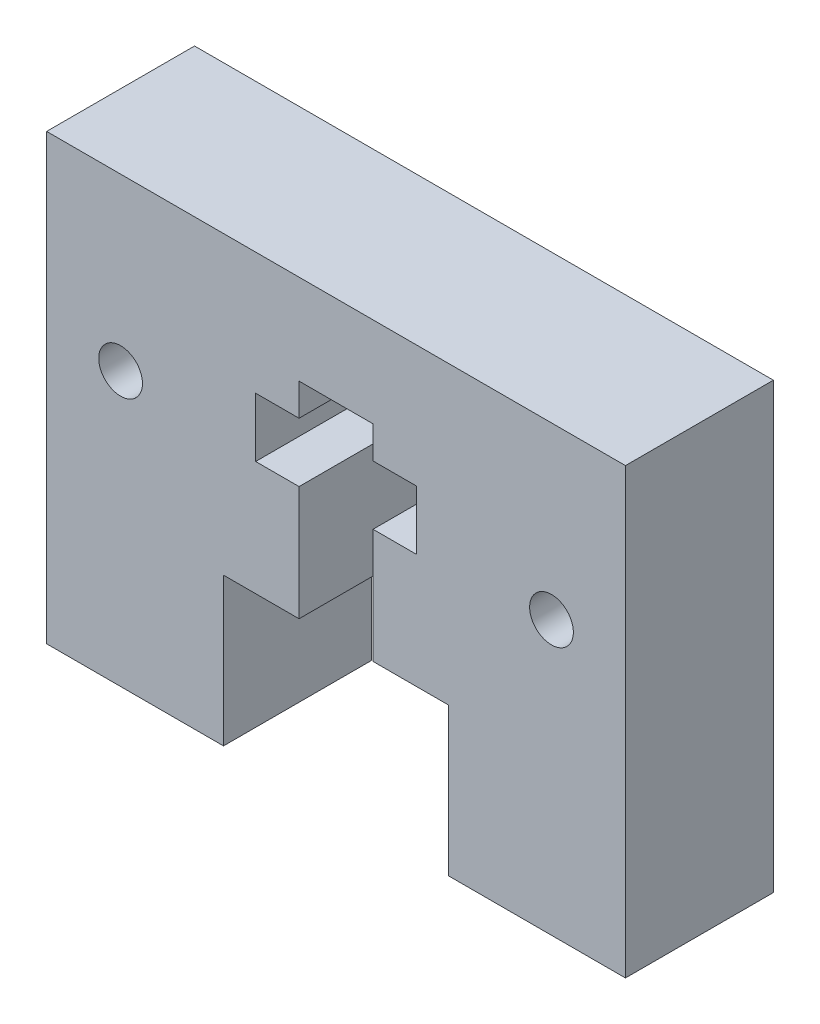
ISO-10303-21;
HEADER;
FILE_DESCRIPTION(('STEP AP214'),'2;1');
FILE_NAME('part.step','',(''),(''),'','','');
FILE_SCHEMA(('AUTOMOTIVE_DESIGN { 1 0 10303 214 1 1 1 1 }'));
ENDSEC;
DATA;
#1=APPLICATION_CONTEXT('core data for automotive mechanical design processes');
#2=APPLICATION_PROTOCOL_DEFINITION('international standard','automotive_design',2000,#1);
#3=PRODUCT_CONTEXT('',#1,'mechanical');
#4=PRODUCT('Part','Part','',(#3));
#5=PRODUCT_RELATED_PRODUCT_CATEGORY('part','',(#4));
#6=PRODUCT_DEFINITION_FORMATION('','',#4);
#7=PRODUCT_DEFINITION_CONTEXT('part definition',#1,'design');
#8=PRODUCT_DEFINITION('design','',#6,#7);
#9=PRODUCT_DEFINITION_SHAPE('','',#8);
#10=(LENGTH_UNIT() NAMED_UNIT(*) SI_UNIT(.MILLI.,.METRE.));
#11=(NAMED_UNIT(*) PLANE_ANGLE_UNIT() SI_UNIT($,.RADIAN.));
#12=(NAMED_UNIT(*) SI_UNIT($,.STERADIAN.) SOLID_ANGLE_UNIT());
#13=UNCERTAINTY_MEASURE_WITH_UNIT(LENGTH_MEASURE(1.E-05),#10,'distance_accuracy_value','');
#14=(GEOMETRIC_REPRESENTATION_CONTEXT(3) GLOBAL_UNCERTAINTY_ASSIGNED_CONTEXT((#13)) GLOBAL_UNIT_ASSIGNED_CONTEXT((#10,
#11,#12)) REPRESENTATION_CONTEXT('',''));
#15=CARTESIAN_POINT('',(0.,0.,0.));
#16=DIRECTION('',(0.,0.,1.));
#17=DIRECTION('',(1.,0.,0.));
#18=AXIS2_PLACEMENT_3D('',#15,#16,#17);
#19=CARTESIAN_POINT('',(-35.71875,0.,5.842));
#20=DIRECTION('',(0.,1.,0.));
#21=DIRECTION('',(0.,0.,1.));
#22=AXIS2_PLACEMENT_3D('',#19,#20,#21);
#23=PLANE('',#22);
#24=DIRECTION('',(1.,0.,0.));
#25=VECTOR('',#24,1.);
#26=CARTESIAN_POINT('',(-35.71875,0.,0.));
#27=LINE('',#26,#25);
#28=CARTESIAN_POINT('',(-35.71875,0.,0.));
#29=VERTEX_POINT('',#28);
#30=CARTESIAN_POINT('',(-32.73425,0.,0.));
#31=VERTEX_POINT('',#30);
#32=EDGE_CURVE('E148',#29,#31,#27,.T.);
#33=ORIENTED_EDGE('',*,*,#32,.T.);
#34=DIRECTION('',(0.,0.,1.));
#35=VECTOR('',#34,1.);
#36=CARTESIAN_POINT('',(-32.73425,0.,0.));
#37=LINE('',#36,#35);
#38=CARTESIAN_POINT('',(-32.73425,0.,5.842));
#39=VERTEX_POINT('',#38);
#40=EDGE_CURVE('E182',#31,#39,#37,.T.);
#41=ORIENTED_EDGE('',*,*,#40,.T.);
#42=DIRECTION('',(1.,0.,0.));
#43=VECTOR('',#42,1.);
#44=CARTESIAN_POINT('',(-35.71875,0.,5.842));
#45=LINE('',#44,#43);
#46=CARTESIAN_POINT('',(-35.71875,0.,5.842));
#47=VERTEX_POINT('',#46);
#48=EDGE_CURVE('E118',#47,#39,#45,.T.);
#49=ORIENTED_EDGE('',*,*,#48,.F.);
#50=DIRECTION('',(0.,0.,-1.));
#51=VECTOR('',#50,1.);
#52=CARTESIAN_POINT('',(-35.71875,0.,5.842));
#53=LINE('',#52,#51);
#54=EDGE_CURVE('E128',#47,#29,#53,.T.);
#55=ORIENTED_EDGE('',*,*,#54,.T.);
#56=EDGE_LOOP('',(#33,#41,#49,#55));
#57=FACE_BOUND('',#56,.T.);
#58=ADVANCED_FACE('F34',(#57),#23,.F.);
#59=CARTESIAN_POINT('',(0.,0.,5.842));
#60=DIRECTION('',(0.,0.,1.));
#61=DIRECTION('',(1.,0.,0.));
#62=AXIS2_PLACEMENT_3D('',#59,#60,#61);
#63=PLANE('',#62);
#64=DIRECTION('',(0.,-1.,0.));
#65=VECTOR('',#64,1.);
#66=CARTESIAN_POINT('',(-32.73425,0.,5.842));
#67=LINE('',#66,#65);
#68=CARTESIAN_POINT('',(-32.73425,4.5212,5.842));
#69=VERTEX_POINT('',#68);
#70=EDGE_CURVE('E350',#69,#39,#67,.T.);
#71=ORIENTED_EDGE('',*,*,#70,.F.);
#72=DIRECTION('',(1.,0.,0.));
#73=VECTOR('',#72,1.);
#74=CARTESIAN_POINT('',(-32.73425,4.5212,5.842));
#75=LINE('',#74,#73);
#76=CARTESIAN_POINT('',(-34.44875,4.5212,5.842));
#77=VERTEX_POINT('',#76);
#78=EDGE_CURVE('E354',#77,#69,#75,.T.);
#79=ORIENTED_EDGE('',*,*,#78,.F.);
#80=DIRECTION('',(0.,-1.,0.));
#81=VECTOR('',#80,1.);
#82=CARTESIAN_POINT('',(-34.44875,4.5212,5.842));
#83=LINE('',#82,#81);
#84=CARTESIAN_POINT('',(-34.44875,6.858,5.842));
#85=VERTEX_POINT('',#84);
#86=EDGE_CURVE('E358',#85,#77,#83,.T.);
#87=ORIENTED_EDGE('',*,*,#86,.F.);
#88=DIRECTION('',(-1.,0.,0.));
#89=VECTOR('',#88,1.);
#90=CARTESIAN_POINT('',(-34.44875,6.858,5.842));
#91=LINE('',#90,#89);
#92=CARTESIAN_POINT('',(-32.73425,6.858,5.842));
#93=VERTEX_POINT('',#92);
#94=EDGE_CURVE('E406',#93,#85,#91,.T.);
#95=ORIENTED_EDGE('',*,*,#94,.F.);
#96=DIRECTION('',(0.,-1.,0.));
#97=VECTOR('',#96,1.);
#98=CARTESIAN_POINT('',(-32.73425,6.858,5.842));
#99=LINE('',#98,#97);
#100=CARTESIAN_POINT('',(-32.73425,8.128,5.842));
#101=VERTEX_POINT('',#100);
#102=EDGE_CURVE('E403',#101,#93,#99,.T.);
#103=ORIENTED_EDGE('',*,*,#102,.F.);
#104=DIRECTION('',(-1.,0.,0.));
#105=VECTOR('',#104,1.);
#106=CARTESIAN_POINT('',(-32.73425,8.128,5.842));
#107=LINE('',#106,#105);
#108=CARTESIAN_POINT('',(-29.81325,8.128,5.842));
#109=VERTEX_POINT('',#108);
#110=EDGE_CURVE('E400',#109,#101,#107,.T.);
#111=ORIENTED_EDGE('',*,*,#110,.F.);
#112=DIRECTION('',(0.,1.,0.));
#113=VECTOR('',#112,1.);
#114=CARTESIAN_POINT('',(-29.81325,8.128,5.842));
#115=LINE('',#114,#113);
#116=CARTESIAN_POINT('',(-29.81325,6.858,5.842));
#117=VERTEX_POINT('',#116);
#118=EDGE_CURVE('E397',#117,#109,#115,.T.);
#119=ORIENTED_EDGE('',*,*,#118,.F.);
#120=DIRECTION('',(-1.,0.,0.));
#121=VECTOR('',#120,1.);
#122=CARTESIAN_POINT('',(-29.81325,6.858,5.842));
#123=LINE('',#122,#121);
#124=CARTESIAN_POINT('',(-28.09875,6.858,5.842));
#125=VERTEX_POINT('',#124);
#126=EDGE_CURVE('E394',#125,#117,#123,.T.);
#127=ORIENTED_EDGE('',*,*,#126,.F.);
#128=DIRECTION('',(0.,1.,0.));
#129=VECTOR('',#128,1.);
#130=CARTESIAN_POINT('',(-28.09875,6.858,5.842));
#131=LINE('',#130,#129);
#132=CARTESIAN_POINT('',(-28.09875,4.5212,5.842));
#133=VERTEX_POINT('',#132);
#134=EDGE_CURVE('E391',#133,#125,#131,.T.);
#135=ORIENTED_EDGE('',*,*,#134,.F.);
#136=DIRECTION('',(1.,0.,0.));
#137=VECTOR('',#136,1.);
#138=CARTESIAN_POINT('',(-28.09875,4.5212,5.842));
#139=LINE('',#138,#137);
#140=CARTESIAN_POINT('',(-29.81325,4.5212,5.842));
#141=VERTEX_POINT('',#140);
#142=EDGE_CURVE('E389',#141,#133,#139,.T.);
#143=ORIENTED_EDGE('',*,*,#142,.F.);
#144=DIRECTION('',(0.,1.,0.));
#145=VECTOR('',#144,1.);
#146=CARTESIAN_POINT('',(-29.81325,4.5212,5.842));
#147=LINE('',#146,#145);
#148=CARTESIAN_POINT('',(-29.81325,0.,5.842));
#149=VERTEX_POINT('',#148);
#150=EDGE_CURVE('E116',#149,#141,#147,.T.);
#151=ORIENTED_EDGE('',*,*,#150,.F.);
#152=CARTESIAN_POINT('',(-26.82875,0.,5.842));
#153=VERTEX_POINT('',#152);
#154=EDGE_CURVE('E105',#149,#153,#45,.T.);
#155=ORIENTED_EDGE('',*,*,#154,.T.);
#156=DIRECTION('',(0.,-1.,0.));
#157=VECTOR('',#156,1.);
#158=CARTESIAN_POINT('',(-26.82875,0.,5.842));
#159=LINE('',#158,#157);
#160=CARTESIAN_POINT('',(-26.82875,-5.842,5.842));
#161=VERTEX_POINT('',#160);
#162=EDGE_CURVE('E111',#153,#161,#159,.T.);
#163=ORIENTED_EDGE('',*,*,#162,.T.);
#164=DIRECTION('',(1.,0.,0.));
#165=VECTOR('',#164,1.);
#166=CARTESIAN_POINT('',(-26.82875,-5.842,5.842));
#167=LINE('',#166,#165);
#168=CARTESIAN_POINT('',(-19.84375,-5.842,5.842));
#169=VERTEX_POINT('',#168);
#170=EDGE_CURVE('E58',#161,#169,#167,.T.);
#171=ORIENTED_EDGE('',*,*,#170,.T.);
#172=DIRECTION('',(0.,1.,0.));
#173=VECTOR('',#172,1.);
#174=CARTESIAN_POINT('',(-19.84375,-5.842,5.842));
#175=LINE('',#174,#173);
#176=CARTESIAN_POINT('',(-19.84375,11.684,5.842));
#177=VERTEX_POINT('',#176);
#178=EDGE_CURVE('E133',#169,#177,#175,.T.);
#179=ORIENTED_EDGE('',*,*,#178,.T.);
#180=DIRECTION('',(-1.,0.,0.));
#181=VECTOR('',#180,1.);
#182=CARTESIAN_POINT('',(-42.70375,11.684,5.842));
#183=LINE('',#182,#181);
#184=CARTESIAN_POINT('',(-42.70375,11.684,5.842));
#185=VERTEX_POINT('',#184);
#186=EDGE_CURVE('E247',#177,#185,#183,.T.);
#187=ORIENTED_EDGE('',*,*,#186,.T.);
#188=DIRECTION('',(0.,-1.,0.));
#189=VECTOR('',#188,1.);
#190=CARTESIAN_POINT('',(-42.70375,7.874,5.842));
#191=LINE('',#190,#189);
#192=CARTESIAN_POINT('',(-42.70375,-5.842,5.842));
#193=VERTEX_POINT('',#192);
#194=EDGE_CURVE('E157',#185,#193,#191,.T.);
#195=ORIENTED_EDGE('',*,*,#194,.T.);
#196=DIRECTION('',(1.,0.,0.));
#197=VECTOR('',#196,1.);
#198=CARTESIAN_POINT('',(-42.70375,-5.842,5.842));
#199=LINE('',#198,#197);
#200=CARTESIAN_POINT('',(-35.71875,-5.842,5.842));
#201=VERTEX_POINT('',#200);
#202=EDGE_CURVE('E93',#193,#201,#199,.T.);
#203=ORIENTED_EDGE('',*,*,#202,.T.);
#204=DIRECTION('',(0.,1.,0.));
#205=VECTOR('',#204,1.);
#206=CARTESIAN_POINT('',(-35.71875,-5.842,5.842));
#207=LINE('',#206,#205);
#208=EDGE_CURVE('E119',#201,#47,#207,.T.);
#209=ORIENTED_EDGE('',*,*,#208,.T.);
#210=ORIENTED_EDGE('',*,*,#48,.T.);
#211=EDGE_LOOP('',(#71,#79,#87,#95,#103,#111,#119,#127,#135,#143,#151,#155,#163,#171,#179,#187,
#195,#203,#209,#210));
#212=FACE_BOUND('',#211,.T.);
#213=CARTESIAN_POINT('',(-39.78275,4.953,5.842));
#214=DIRECTION('',(0.,0.,1.));
#215=DIRECTION('',(1.,0.,0.));
#216=AXIS2_PLACEMENT_3D('',#213,#214,#215);
#217=CIRCLE('',#216,0.8636);
#218=CARTESIAN_POINT('',(-38.91915,4.953,5.842));
#219=VERTEX_POINT('',#218);
#220=EDGE_CURVE('E144',#219,#219,#217,.T.);
#221=ORIENTED_EDGE('',*,*,#220,.F.);
#222=EDGE_LOOP('',(#221));
#223=FACE_BOUND('',#222,.T.);
#224=CARTESIAN_POINT('',(-22.76475,4.95300000000001,5.842));
#225=DIRECTION('',(0.,0.,1.));
#226=DIRECTION('',(-1.,0.,0.));
#227=AXIS2_PLACEMENT_3D('',#224,#225,#226);
#228=CIRCLE('',#227,0.863599999999997);
#229=CARTESIAN_POINT('',(-23.62835,4.95300000000001,5.842));
#230=VERTEX_POINT('',#229);
#231=EDGE_CURVE('E255',#230,#230,#228,.T.);
#232=ORIENTED_EDGE('',*,*,#231,.F.);
#233=EDGE_LOOP('',(#232));
#234=FACE_BOUND('',#233,.T.);
#235=ADVANCED_FACE('F108',(#212,#223,#234),#63,.T.);
#236=CARTESIAN_POINT('',(0.,0.,0.));
#237=DIRECTION('',(0.,0.,1.));
#238=DIRECTION('',(1.,0.,0.));
#239=AXIS2_PLACEMENT_3D('',#236,#237,#238);
#240=PLANE('',#239);
#241=CARTESIAN_POINT('',(-39.78275,4.953,0.));
#242=DIRECTION('',(0.,0.,1.));
#243=DIRECTION('',(1.,0.,0.));
#244=AXIS2_PLACEMENT_3D('',#241,#242,#243);
#245=CIRCLE('',#244,0.8636);
#246=CARTESIAN_POINT('',(-38.91915,4.953,0.));
#247=VERTEX_POINT('',#246);
#248=EDGE_CURVE('E258',#247,#247,#245,.T.);
#249=ORIENTED_EDGE('',*,*,#248,.T.);
#250=EDGE_LOOP('',(#249));
#251=FACE_BOUND('',#250,.T.);
#252=DIRECTION('',(1.,0.,0.));
#253=VECTOR('',#252,1.);
#254=CARTESIAN_POINT('',(-32.73425,4.5212,0.));
#255=LINE('',#254,#253);
#256=CARTESIAN_POINT('',(-34.44875,4.5212,0.));
#257=VERTEX_POINT('',#256);
#258=CARTESIAN_POINT('',(-32.73425,4.5212,0.));
#259=VERTEX_POINT('',#258);
#260=EDGE_CURVE('E382',#257,#259,#255,.T.);
#261=ORIENTED_EDGE('',*,*,#260,.T.);
#262=DIRECTION('',(0.,-1.,0.));
#263=VECTOR('',#262,1.);
#264=CARTESIAN_POINT('',(-32.73425,0.,0.));
#265=LINE('',#264,#263);
#266=EDGE_CURVE('E176',#259,#31,#265,.T.);
#267=ORIENTED_EDGE('',*,*,#266,.T.);
#268=ORIENTED_EDGE('',*,*,#32,.F.);
#269=DIRECTION('',(0.,1.,0.));
#270=VECTOR('',#269,1.);
#271=CARTESIAN_POINT('',(-35.71875,-5.842,0.));
#272=LINE('',#271,#270);
#273=CARTESIAN_POINT('',(-35.71875,-5.842,0.));
#274=VERTEX_POINT('',#273);
#275=EDGE_CURVE('E146',#274,#29,#272,.T.);
#276=ORIENTED_EDGE('',*,*,#275,.F.);
#277=DIRECTION('',(1.,0.,0.));
#278=VECTOR('',#277,1.);
#279=CARTESIAN_POINT('',(-42.70375,-5.842,0.));
#280=LINE('',#279,#278);
#281=CARTESIAN_POINT('',(-42.70375,-5.842,0.));
#282=VERTEX_POINT('',#281);
#283=EDGE_CURVE('E143',#282,#274,#280,.T.);
#284=ORIENTED_EDGE('',*,*,#283,.F.);
#285=DIRECTION('',(0.,-1.,0.));
#286=VECTOR('',#285,1.);
#287=CARTESIAN_POINT('',(-42.70375,7.874,0.));
#288=LINE('',#287,#286);
#289=CARTESIAN_POINT('',(-42.70375,11.684,0.));
#290=VERTEX_POINT('',#289);
#291=EDGE_CURVE('E140',#290,#282,#288,.T.);
#292=ORIENTED_EDGE('',*,*,#291,.F.);
#293=DIRECTION('',(-1.,0.,0.));
#294=VECTOR('',#293,1.);
#295=CARTESIAN_POINT('',(-42.70375,11.684,0.));
#296=LINE('',#295,#294);
#297=CARTESIAN_POINT('',(-19.84375,11.684,0.));
#298=VERTEX_POINT('',#297);
#299=EDGE_CURVE('E232',#298,#290,#296,.T.);
#300=ORIENTED_EDGE('',*,*,#299,.F.);
#301=DIRECTION('',(0.,1.,0.));
#302=VECTOR('',#301,1.);
#303=CARTESIAN_POINT('',(-19.84375,-5.842,0.));
#304=LINE('',#303,#302);
#305=CARTESIAN_POINT('',(-19.84375,-5.842,0.));
#306=VERTEX_POINT('',#305);
#307=EDGE_CURVE('E154',#306,#298,#304,.T.);
#308=ORIENTED_EDGE('',*,*,#307,.F.);
#309=DIRECTION('',(1.,0.,0.));
#310=VECTOR('',#309,1.);
#311=CARTESIAN_POINT('',(-26.82875,-5.842,0.));
#312=LINE('',#311,#310);
#313=CARTESIAN_POINT('',(-26.82875,-5.842,0.));
#314=VERTEX_POINT('',#313);
#315=EDGE_CURVE('E85',#314,#306,#312,.T.);
#316=ORIENTED_EDGE('',*,*,#315,.F.);
#317=DIRECTION('',(0.,-1.,0.));
#318=VECTOR('',#317,1.);
#319=CARTESIAN_POINT('',(-26.82875,0.,0.));
#320=LINE('',#319,#318);
#321=CARTESIAN_POINT('',(-26.82875,0.,0.));
#322=VERTEX_POINT('',#321);
#323=EDGE_CURVE('E151',#322,#314,#320,.T.);
#324=ORIENTED_EDGE('',*,*,#323,.F.);
#325=CARTESIAN_POINT('',(-29.81325,0.,0.));
#326=VERTEX_POINT('',#325);
#327=EDGE_CURVE('E125',#326,#322,#27,.T.);
#328=ORIENTED_EDGE('',*,*,#327,.F.);
#329=DIRECTION('',(0.,1.,0.));
#330=VECTOR('',#329,1.);
#331=CARTESIAN_POINT('',(-29.81325,4.5212,0.));
#332=LINE('',#331,#330);
#333=CARTESIAN_POINT('',(-29.81325,4.5212,0.));
#334=VERTEX_POINT('',#333);
#335=EDGE_CURVE('E49',#326,#334,#332,.T.);
#336=ORIENTED_EDGE('',*,*,#335,.T.);
#337=DIRECTION('',(1.,0.,0.));
#338=VECTOR('',#337,1.);
#339=CARTESIAN_POINT('',(-28.09875,4.5212,0.));
#340=LINE('',#339,#338);
#341=CARTESIAN_POINT('',(-28.09875,4.5212,0.));
#342=VERTEX_POINT('',#341);
#343=EDGE_CURVE('E356',#334,#342,#340,.T.);
#344=ORIENTED_EDGE('',*,*,#343,.T.);
#345=DIRECTION('',(0.,1.,0.));
#346=VECTOR('',#345,1.);
#347=CARTESIAN_POINT('',(-28.09875,6.858,0.));
#348=LINE('',#347,#346);
#349=CARTESIAN_POINT('',(-28.09875,6.858,0.));
#350=VERTEX_POINT('',#349);
#351=EDGE_CURVE('E434',#342,#350,#348,.T.);
#352=ORIENTED_EDGE('',*,*,#351,.T.);
#353=DIRECTION('',(-1.,0.,0.));
#354=VECTOR('',#353,1.);
#355=CARTESIAN_POINT('',(-29.81325,6.858,0.));
#356=LINE('',#355,#354);
#357=CARTESIAN_POINT('',(-29.81325,6.858,0.));
#358=VERTEX_POINT('',#357);
#359=EDGE_CURVE('E431',#350,#358,#356,.T.);
#360=ORIENTED_EDGE('',*,*,#359,.T.);
#361=DIRECTION('',(0.,1.,0.));
#362=VECTOR('',#361,1.);
#363=CARTESIAN_POINT('',(-29.81325,8.128,0.));
#364=LINE('',#363,#362);
#365=CARTESIAN_POINT('',(-29.81325,8.128,0.));
#366=VERTEX_POINT('',#365);
#367=EDGE_CURVE('E428',#358,#366,#364,.T.);
#368=ORIENTED_EDGE('',*,*,#367,.T.);
#369=DIRECTION('',(-1.,0.,0.));
#370=VECTOR('',#369,1.);
#371=CARTESIAN_POINT('',(-32.73425,8.128,0.));
#372=LINE('',#371,#370);
#373=CARTESIAN_POINT('',(-32.73425,8.128,0.));
#374=VERTEX_POINT('',#373);
#375=EDGE_CURVE('E425',#366,#374,#372,.T.);
#376=ORIENTED_EDGE('',*,*,#375,.T.);
#377=DIRECTION('',(0.,-1.,0.));
#378=VECTOR('',#377,1.);
#379=CARTESIAN_POINT('',(-32.73425,6.858,0.));
#380=LINE('',#379,#378);
#381=CARTESIAN_POINT('',(-32.73425,6.858,0.));
#382=VERTEX_POINT('',#381);
#383=EDGE_CURVE('E421',#374,#382,#380,.T.);
#384=ORIENTED_EDGE('',*,*,#383,.T.);
#385=DIRECTION('',(-1.,0.,0.));
#386=VECTOR('',#385,1.);
#387=CARTESIAN_POINT('',(-34.44875,6.858,0.));
#388=LINE('',#387,#386);
#389=CARTESIAN_POINT('',(-34.44875,6.858,0.));
#390=VERTEX_POINT('',#389);
#391=EDGE_CURVE('E420',#382,#390,#388,.T.);
#392=ORIENTED_EDGE('',*,*,#391,.T.);
#393=DIRECTION('',(0.,-1.,0.));
#394=VECTOR('',#393,1.);
#395=CARTESIAN_POINT('',(-34.44875,4.5212,0.));
#396=LINE('',#395,#394);
#397=EDGE_CURVE('E384',#390,#257,#396,.T.);
#398=ORIENTED_EDGE('',*,*,#397,.T.);
#399=EDGE_LOOP('',(#261,#267,#268,#276,#284,#292,#300,#308,#316,#324,#328,#336,#344,#352,#360,
#368,#376,#384,#392,#398));
#400=FACE_BOUND('',#399,.T.);
#401=CARTESIAN_POINT('',(-22.76475,4.95300000000001,0.));
#402=DIRECTION('',(0.,0.,1.));
#403=DIRECTION('',(-1.,0.,0.));
#404=AXIS2_PLACEMENT_3D('',#401,#402,#403);
#405=CIRCLE('',#404,0.863599999999997);
#406=CARTESIAN_POINT('',(-23.62835,4.95300000000001,0.));
#407=VERTEX_POINT('',#406);
#408=EDGE_CURVE('E241',#407,#407,#405,.T.);
#409=ORIENTED_EDGE('',*,*,#408,.T.);
#410=EDGE_LOOP('',(#409));
#411=FACE_BOUND('',#410,.T.);
#412=ADVANCED_FACE('F170',(#251,#400,#411),#240,.F.);
#413=CARTESIAN_POINT('',(-42.70375,7.874,5.842));
#414=DIRECTION('',(1.,0.,0.));
#415=DIRECTION('',(0.,0.,-1.));
#416=AXIS2_PLACEMENT_3D('',#413,#414,#415);
#417=PLANE('',#416);
#418=ORIENTED_EDGE('',*,*,#291,.T.);
#419=DIRECTION('',(0.,0.,-1.));
#420=VECTOR('',#419,1.);
#421=CARTESIAN_POINT('',(-42.70375,-5.842,5.842));
#422=LINE('',#421,#420);
#423=EDGE_CURVE('E11',#193,#282,#422,.T.);
#424=ORIENTED_EDGE('',*,*,#423,.F.);
#425=ORIENTED_EDGE('',*,*,#194,.F.);
#426=DIRECTION('',(0.,0.,1.));
#427=VECTOR('',#426,1.);
#428=CARTESIAN_POINT('',(-42.70375,11.684,0.));
#429=LINE('',#428,#427);
#430=EDGE_CURVE('E237',#290,#185,#429,.T.);
#431=ORIENTED_EDGE('',*,*,#430,.F.);
#432=EDGE_LOOP('',(#418,#424,#425,#431));
#433=FACE_BOUND('',#432,.T.);
#434=ADVANCED_FACE('F36',(#433),#417,.F.);
#435=CARTESIAN_POINT('',(-42.70375,-5.842,5.842));
#436=DIRECTION('',(0.,1.,0.));
#437=DIRECTION('',(0.,0.,1.));
#438=AXIS2_PLACEMENT_3D('',#435,#436,#437);
#439=PLANE('',#438);
#440=ORIENTED_EDGE('',*,*,#283,.T.);
#441=DIRECTION('',(0.,0.,-1.));
#442=VECTOR('',#441,1.);
#443=CARTESIAN_POINT('',(-35.71875,-5.842,5.842));
#444=LINE('',#443,#442);
#445=EDGE_CURVE('E42',#201,#274,#444,.T.);
#446=ORIENTED_EDGE('',*,*,#445,.F.);
#447=ORIENTED_EDGE('',*,*,#202,.F.);
#448=ORIENTED_EDGE('',*,*,#423,.T.);
#449=EDGE_LOOP('',(#440,#446,#447,#448));
#450=FACE_BOUND('',#449,.T.);
#451=ADVANCED_FACE('F266',(#450),#439,.F.);
#452=CARTESIAN_POINT('',(-35.71875,-5.842,5.842));
#453=DIRECTION('',(-1.,0.,0.));
#454=DIRECTION('',(0.,-1.,0.));
#455=AXIS2_PLACEMENT_3D('',#452,#453,#454);
#456=PLANE('',#455);
#457=ORIENTED_EDGE('',*,*,#275,.T.);
#458=ORIENTED_EDGE('',*,*,#54,.F.);
#459=ORIENTED_EDGE('',*,*,#208,.F.);
#460=ORIENTED_EDGE('',*,*,#445,.T.);
#461=EDGE_LOOP('',(#457,#458,#459,#460));
#462=FACE_BOUND('',#461,.T.);
#463=ADVANCED_FACE('F165',(#462),#456,.F.);
#464=ORIENTED_EDGE('',*,*,#154,.F.);
#465=DIRECTION('',(0.,0.,1.));
#466=VECTOR('',#465,1.);
#467=CARTESIAN_POINT('',(-29.81325,0.,0.));
#468=LINE('',#467,#466);
#469=EDGE_CURVE('E252',#326,#149,#468,.T.);
#470=ORIENTED_EDGE('',*,*,#469,.F.);
#471=ORIENTED_EDGE('',*,*,#327,.T.);
#472=DIRECTION('',(0.,0.,-1.));
#473=VECTOR('',#472,1.);
#474=CARTESIAN_POINT('',(-26.82875,0.,5.842));
#475=LINE('',#474,#473);
#476=EDGE_CURVE('E122',#153,#322,#475,.T.);
#477=ORIENTED_EDGE('',*,*,#476,.F.);
#478=EDGE_LOOP('',(#464,#470,#471,#477));
#479=FACE_BOUND('',#478,.T.);
#480=ADVANCED_FACE('F123',(#479),#23,.F.);
#481=CARTESIAN_POINT('',(-26.82875,0.,5.842));
#482=DIRECTION('',(1.,0.,0.));
#483=DIRECTION('',(0.,0.,-1.));
#484=AXIS2_PLACEMENT_3D('',#481,#482,#483);
#485=PLANE('',#484);
#486=ORIENTED_EDGE('',*,*,#323,.T.);
#487=DIRECTION('',(0.,0.,-1.));
#488=VECTOR('',#487,1.);
#489=CARTESIAN_POINT('',(-26.82875,-5.842,5.842));
#490=LINE('',#489,#488);
#491=EDGE_CURVE('E129',#161,#314,#490,.T.);
#492=ORIENTED_EDGE('',*,*,#491,.F.);
#493=ORIENTED_EDGE('',*,*,#162,.F.);
#494=ORIENTED_EDGE('',*,*,#476,.T.);
#495=EDGE_LOOP('',(#486,#492,#493,#494));
#496=FACE_BOUND('',#495,.T.);
#497=ADVANCED_FACE('F131',(#496),#485,.F.);
#498=CARTESIAN_POINT('',(-26.82875,-5.842,5.842));
#499=DIRECTION('',(0.,1.,0.));
#500=DIRECTION('',(0.,0.,1.));
#501=AXIS2_PLACEMENT_3D('',#498,#499,#500);
#502=PLANE('',#501);
#503=ORIENTED_EDGE('',*,*,#315,.T.);
#504=DIRECTION('',(0.,0.,-1.));
#505=VECTOR('',#504,1.);
#506=CARTESIAN_POINT('',(-19.84375,-5.842,5.842));
#507=LINE('',#506,#505);
#508=EDGE_CURVE('E139',#169,#306,#507,.T.);
#509=ORIENTED_EDGE('',*,*,#508,.F.);
#510=ORIENTED_EDGE('',*,*,#170,.F.);
#511=ORIENTED_EDGE('',*,*,#491,.T.);
#512=EDGE_LOOP('',(#503,#509,#510,#511));
#513=FACE_BOUND('',#512,.T.);
#514=ADVANCED_FACE('F284',(#513),#502,.F.);
#515=CARTESIAN_POINT('',(-19.84375,-5.842,5.842));
#516=DIRECTION('',(-1.,0.,0.));
#517=DIRECTION('',(0.,0.,1.));
#518=AXIS2_PLACEMENT_3D('',#515,#516,#517);
#519=PLANE('',#518);
#520=ORIENTED_EDGE('',*,*,#307,.T.);
#521=DIRECTION('',(0.,0.,1.));
#522=VECTOR('',#521,1.);
#523=CARTESIAN_POINT('',(-19.84375,11.684,0.));
#524=LINE('',#523,#522);
#525=EDGE_CURVE('E242',#298,#177,#524,.T.);
#526=ORIENTED_EDGE('',*,*,#525,.T.);
#527=ORIENTED_EDGE('',*,*,#178,.F.);
#528=ORIENTED_EDGE('',*,*,#508,.T.);
#529=EDGE_LOOP('',(#520,#526,#527,#528));
#530=FACE_BOUND('',#529,.T.);
#531=ADVANCED_FACE('F288',(#530),#519,.F.);
#532=CARTESIAN_POINT('',(-39.78275,4.953,5.842));
#533=DIRECTION('',(0.,0.,-1.));
#534=DIRECTION('',(-1.,0.,0.));
#535=AXIS2_PLACEMENT_3D('',#532,#533,#534);
#536=CYLINDRICAL_SURFACE('',#535,0.8636);
#537=ORIENTED_EDGE('',*,*,#220,.T.);
#538=EDGE_LOOP('',(#537));
#539=FACE_BOUND('',#538,.T.);
#540=ORIENTED_EDGE('',*,*,#248,.F.);
#541=EDGE_LOOP('',(#540));
#542=FACE_BOUND('',#541,.T.);
#543=ADVANCED_FACE('F293',(#539,#542),#536,.F.);
#544=CARTESIAN_POINT('',(-22.76475,4.95300000000001,5.842));
#545=DIRECTION('',(0.,0.,-1.));
#546=DIRECTION('',(-1.,0.,0.));
#547=AXIS2_PLACEMENT_3D('',#544,#545,#546);
#548=CYLINDRICAL_SURFACE('',#547,0.863599999999997);
#549=ORIENTED_EDGE('',*,*,#231,.T.);
#550=EDGE_LOOP('',(#549));
#551=FACE_BOUND('',#550,.T.);
#552=ORIENTED_EDGE('',*,*,#408,.F.);
#553=EDGE_LOOP('',(#552));
#554=FACE_BOUND('',#553,.T.);
#555=ADVANCED_FACE('F300',(#551,#554),#548,.F.);
#556=CARTESIAN_POINT('',(-42.70375,11.684,0.));
#557=DIRECTION('',(0.,1.,0.));
#558=DIRECTION('',(0.,0.,1.));
#559=AXIS2_PLACEMENT_3D('',#556,#557,#558);
#560=PLANE('',#559);
#561=ORIENTED_EDGE('',*,*,#186,.F.);
#562=ORIENTED_EDGE('',*,*,#525,.F.);
#563=ORIENTED_EDGE('',*,*,#299,.T.);
#564=ORIENTED_EDGE('',*,*,#430,.T.);
#565=EDGE_LOOP('',(#561,#562,#563,#564));
#566=FACE_BOUND('',#565,.T.);
#567=ADVANCED_FACE('F245',(#566),#560,.T.);
#568=CARTESIAN_POINT('',(-32.73425,0.,0.));
#569=DIRECTION('',(-1.,0.,0.));
#570=DIRECTION('',(0.,0.,1.));
#571=AXIS2_PLACEMENT_3D('',#568,#569,#570);
#572=PLANE('',#571);
#573=ORIENTED_EDGE('',*,*,#70,.T.);
#574=ORIENTED_EDGE('',*,*,#40,.F.);
#575=ORIENTED_EDGE('',*,*,#266,.F.);
#576=DIRECTION('',(0.,0.,1.));
#577=VECTOR('',#576,1.);
#578=CARTESIAN_POINT('',(-32.73425,4.5212,0.));
#579=LINE('',#578,#577);
#580=EDGE_CURVE('E351',#259,#69,#579,.T.);
#581=ORIENTED_EDGE('',*,*,#580,.T.);
#582=EDGE_LOOP('',(#573,#574,#575,#581));
#583=FACE_BOUND('',#582,.T.);
#584=ADVANCED_FACE('F307',(#583),#572,.F.);
#585=CARTESIAN_POINT('',(-32.73425,4.5212,0.));
#586=DIRECTION('',(0.,-1.,0.));
#587=DIRECTION('',(0.,0.,-1.));
#588=AXIS2_PLACEMENT_3D('',#585,#586,#587);
#589=PLANE('',#588);
#590=ORIENTED_EDGE('',*,*,#78,.T.);
#591=ORIENTED_EDGE('',*,*,#580,.F.);
#592=ORIENTED_EDGE('',*,*,#260,.F.);
#593=DIRECTION('',(0.,0.,1.));
#594=VECTOR('',#593,1.);
#595=CARTESIAN_POINT('',(-34.44875,4.5212,0.));
#596=LINE('',#595,#594);
#597=EDGE_CURVE('E364',#257,#77,#596,.T.);
#598=ORIENTED_EDGE('',*,*,#597,.T.);
#599=EDGE_LOOP('',(#590,#591,#592,#598));
#600=FACE_BOUND('',#599,.T.);
#601=ADVANCED_FACE('F342',(#600),#589,.F.);
#602=CARTESIAN_POINT('',(-34.44875,4.5212,0.));
#603=DIRECTION('',(-1.,0.,0.));
#604=DIRECTION('',(0.,0.,1.));
#605=AXIS2_PLACEMENT_3D('',#602,#603,#604);
#606=PLANE('',#605);
#607=ORIENTED_EDGE('',*,*,#86,.T.);
#608=ORIENTED_EDGE('',*,*,#597,.F.);
#609=ORIENTED_EDGE('',*,*,#397,.F.);
#610=DIRECTION('',(0.,0.,1.));
#611=VECTOR('',#610,1.);
#612=CARTESIAN_POINT('',(-34.44875,6.858,0.));
#613=LINE('',#612,#611);
#614=EDGE_CURVE('E366',#390,#85,#613,.T.);
#615=ORIENTED_EDGE('',*,*,#614,.T.);
#616=EDGE_LOOP('',(#607,#608,#609,#615));
#617=FACE_BOUND('',#616,.T.);
#618=ADVANCED_FACE('F338',(#617),#606,.F.);
#619=CARTESIAN_POINT('',(-34.44875,6.858,0.));
#620=DIRECTION('',(0.,1.,0.));
#621=DIRECTION('',(0.,0.,1.));
#622=AXIS2_PLACEMENT_3D('',#619,#620,#621);
#623=PLANE('',#622);
#624=ORIENTED_EDGE('',*,*,#94,.T.);
#625=ORIENTED_EDGE('',*,*,#614,.F.);
#626=ORIENTED_EDGE('',*,*,#391,.F.);
#627=DIRECTION('',(0.,0.,1.));
#628=VECTOR('',#627,1.);
#629=CARTESIAN_POINT('',(-32.73425,6.858,0.));
#630=LINE('',#629,#628);
#631=EDGE_CURVE('E368',#382,#93,#630,.T.);
#632=ORIENTED_EDGE('',*,*,#631,.T.);
#633=EDGE_LOOP('',(#624,#625,#626,#632));
#634=FACE_BOUND('',#633,.T.);
#635=ADVANCED_FACE('F334',(#634),#623,.F.);
#636=CARTESIAN_POINT('',(-32.73425,6.858,0.));
#637=DIRECTION('',(-1.,0.,0.));
#638=DIRECTION('',(0.,-1.,0.));
#639=AXIS2_PLACEMENT_3D('',#636,#637,#638);
#640=PLANE('',#639);
#641=ORIENTED_EDGE('',*,*,#102,.T.);
#642=ORIENTED_EDGE('',*,*,#631,.F.);
#643=ORIENTED_EDGE('',*,*,#383,.F.);
#644=DIRECTION('',(0.,0.,1.));
#645=VECTOR('',#644,1.);
#646=CARTESIAN_POINT('',(-32.73425,8.128,0.));
#647=LINE('',#646,#645);
#648=EDGE_CURVE('E370',#374,#101,#647,.T.);
#649=ORIENTED_EDGE('',*,*,#648,.T.);
#650=EDGE_LOOP('',(#641,#642,#643,#649));
#651=FACE_BOUND('',#650,.T.);
#652=ADVANCED_FACE('F330',(#651),#640,.F.);
#653=CARTESIAN_POINT('',(-32.73425,8.128,0.));
#654=DIRECTION('',(0.,1.,0.));
#655=DIRECTION('',(0.,0.,1.));
#656=AXIS2_PLACEMENT_3D('',#653,#654,#655);
#657=PLANE('',#656);
#658=ORIENTED_EDGE('',*,*,#110,.T.);
#659=ORIENTED_EDGE('',*,*,#648,.F.);
#660=ORIENTED_EDGE('',*,*,#375,.F.);
#661=DIRECTION('',(0.,0.,1.));
#662=VECTOR('',#661,1.);
#663=CARTESIAN_POINT('',(-29.81325,8.128,0.));
#664=LINE('',#663,#662);
#665=EDGE_CURVE('E372',#366,#109,#664,.T.);
#666=ORIENTED_EDGE('',*,*,#665,.T.);
#667=EDGE_LOOP('',(#658,#659,#660,#666));
#668=FACE_BOUND('',#667,.T.);
#669=ADVANCED_FACE('F326',(#668),#657,.F.);
#670=CARTESIAN_POINT('',(-29.81325,8.128,0.));
#671=DIRECTION('',(1.,0.,0.));
#672=DIRECTION('',(0.,1.,0.));
#673=AXIS2_PLACEMENT_3D('',#670,#671,#672);
#674=PLANE('',#673);
#675=ORIENTED_EDGE('',*,*,#118,.T.);
#676=ORIENTED_EDGE('',*,*,#665,.F.);
#677=ORIENTED_EDGE('',*,*,#367,.F.);
#678=DIRECTION('',(0.,0.,1.));
#679=VECTOR('',#678,1.);
#680=CARTESIAN_POINT('',(-29.81325,6.858,0.));
#681=LINE('',#680,#679);
#682=EDGE_CURVE('E374',#358,#117,#681,.T.);
#683=ORIENTED_EDGE('',*,*,#682,.T.);
#684=EDGE_LOOP('',(#675,#676,#677,#683));
#685=FACE_BOUND('',#684,.T.);
#686=ADVANCED_FACE('F322',(#685),#674,.F.);
#687=CARTESIAN_POINT('',(-29.81325,6.858,0.));
#688=DIRECTION('',(0.,1.,0.));
#689=DIRECTION('',(0.,0.,1.));
#690=AXIS2_PLACEMENT_3D('',#687,#688,#689);
#691=PLANE('',#690);
#692=ORIENTED_EDGE('',*,*,#126,.T.);
#693=ORIENTED_EDGE('',*,*,#682,.F.);
#694=ORIENTED_EDGE('',*,*,#359,.F.);
#695=DIRECTION('',(0.,0.,1.));
#696=VECTOR('',#695,1.);
#697=CARTESIAN_POINT('',(-28.09875,6.858,0.));
#698=LINE('',#697,#696);
#699=EDGE_CURVE('E376',#350,#125,#698,.T.);
#700=ORIENTED_EDGE('',*,*,#699,.T.);
#701=EDGE_LOOP('',(#692,#693,#694,#700));
#702=FACE_BOUND('',#701,.T.);
#703=ADVANCED_FACE('F318',(#702),#691,.F.);
#704=CARTESIAN_POINT('',(-28.09875,6.858,0.));
#705=DIRECTION('',(1.,0.,0.));
#706=DIRECTION('',(0.,1.,0.));
#707=AXIS2_PLACEMENT_3D('',#704,#705,#706);
#708=PLANE('',#707);
#709=ORIENTED_EDGE('',*,*,#134,.T.);
#710=ORIENTED_EDGE('',*,*,#699,.F.);
#711=ORIENTED_EDGE('',*,*,#351,.F.);
#712=DIRECTION('',(0.,0.,1.));
#713=VECTOR('',#712,1.);
#714=CARTESIAN_POINT('',(-28.09875,4.5212,0.));
#715=LINE('',#714,#713);
#716=EDGE_CURVE('E378',#342,#133,#715,.T.);
#717=ORIENTED_EDGE('',*,*,#716,.T.);
#718=EDGE_LOOP('',(#709,#710,#711,#717));
#719=FACE_BOUND('',#718,.T.);
#720=ADVANCED_FACE('F314',(#719),#708,.F.);
#721=CARTESIAN_POINT('',(-28.09875,4.5212,0.));
#722=DIRECTION('',(0.,-1.,0.));
#723=DIRECTION('',(0.,0.,-1.));
#724=AXIS2_PLACEMENT_3D('',#721,#722,#723);
#725=PLANE('',#724);
#726=ORIENTED_EDGE('',*,*,#142,.T.);
#727=ORIENTED_EDGE('',*,*,#716,.F.);
#728=ORIENTED_EDGE('',*,*,#343,.F.);
#729=DIRECTION('',(0.,0.,1.));
#730=VECTOR('',#729,1.);
#731=CARTESIAN_POINT('',(-29.81325,4.5212,0.));
#732=LINE('',#731,#730);
#733=EDGE_CURVE('E379',#334,#141,#732,.T.);
#734=ORIENTED_EDGE('',*,*,#733,.T.);
#735=EDGE_LOOP('',(#726,#727,#728,#734));
#736=FACE_BOUND('',#735,.T.);
#737=ADVANCED_FACE('F311',(#736),#725,.F.);
#738=CARTESIAN_POINT('',(-29.81325,4.5212,0.));
#739=DIRECTION('',(1.,0.,0.));
#740=DIRECTION('',(0.,0.,-1.));
#741=AXIS2_PLACEMENT_3D('',#738,#739,#740);
#742=PLANE('',#741);
#743=ORIENTED_EDGE('',*,*,#150,.T.);
#744=ORIENTED_EDGE('',*,*,#733,.F.);
#745=ORIENTED_EDGE('',*,*,#335,.F.);
#746=ORIENTED_EDGE('',*,*,#469,.T.);
#747=EDGE_LOOP('',(#743,#744,#745,#746));
#748=FACE_BOUND('',#747,.T.);
#749=ADVANCED_FACE('F308',(#748),#742,.F.);
#750=CLOSED_SHELL('',(#58,#235,#412,#434,#451,#463,#480,#497,#514,#531,#543,#555,#567,#584,#601,
#618,#635,#652,#669,#686,#703,#720,#737,#749));
#751=MANIFOLD_SOLID_BREP('B2',#750);
#752=ADVANCED_BREP_SHAPE_REPRESENTATION('',(#18,#751),#14);
#753=SHAPE_DEFINITION_REPRESENTATION(#9,#752);
ENDSEC;
END-ISO-10303-21;
